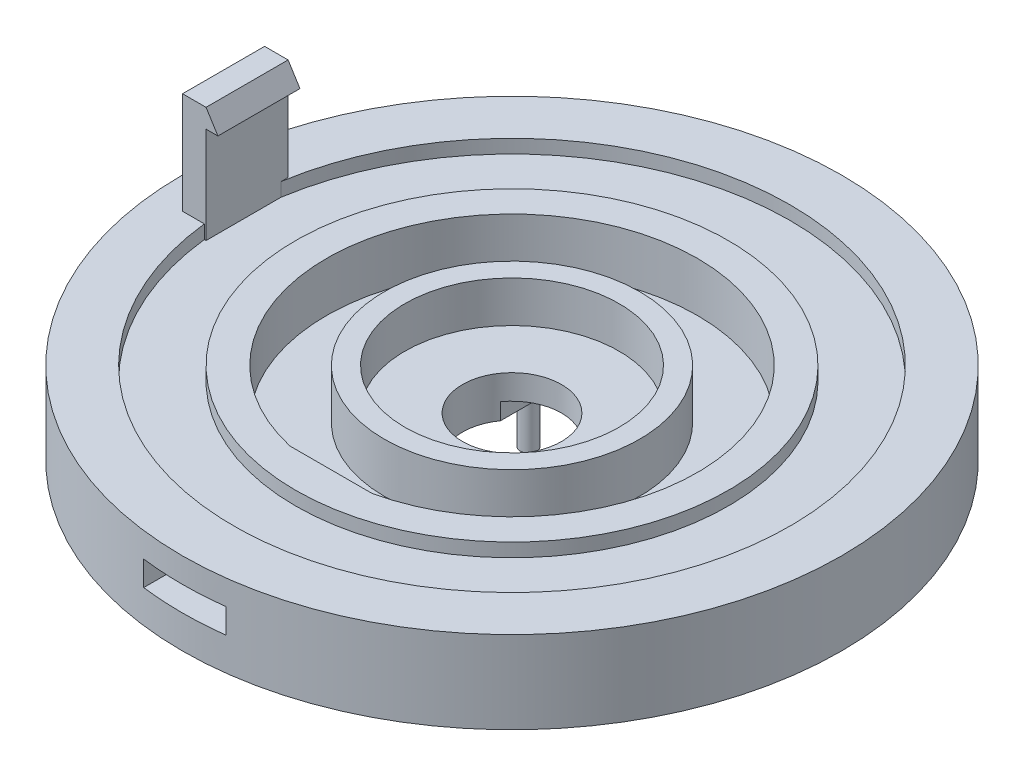
ISO-10303-21;
HEADER;
FILE_DESCRIPTION(('STEP AP214'),'2;1');
FILE_NAME('part.step','',(''),(''),'','','');
FILE_SCHEMA(('AUTOMOTIVE_DESIGN { 1 0 10303 214 1 1 1 1 }'));
ENDSEC;
DATA;
#1=APPLICATION_CONTEXT('core data for automotive mechanical design processes');
#2=APPLICATION_PROTOCOL_DEFINITION('international standard','automotive_design',2000,#1);
#3=PRODUCT_CONTEXT('',#1,'mechanical');
#4=PRODUCT('Part','Part','',(#3));
#5=PRODUCT_RELATED_PRODUCT_CATEGORY('part','',(#4));
#6=PRODUCT_DEFINITION_FORMATION('','',#4);
#7=PRODUCT_DEFINITION_CONTEXT('part definition',#1,'design');
#8=PRODUCT_DEFINITION('design','',#6,#7);
#9=PRODUCT_DEFINITION_SHAPE('','',#8);
#10=(LENGTH_UNIT() NAMED_UNIT(*) SI_UNIT(.MILLI.,.METRE.));
#11=(NAMED_UNIT(*) PLANE_ANGLE_UNIT() SI_UNIT($,.RADIAN.));
#12=(NAMED_UNIT(*) SI_UNIT($,.STERADIAN.) SOLID_ANGLE_UNIT());
#13=UNCERTAINTY_MEASURE_WITH_UNIT(LENGTH_MEASURE(1.E-05),#10,'distance_accuracy_value','');
#14=(GEOMETRIC_REPRESENTATION_CONTEXT(3) GLOBAL_UNCERTAINTY_ASSIGNED_CONTEXT((#13)) GLOBAL_UNIT_ASSIGNED_CONTEXT((#10,
#11,#12)) REPRESENTATION_CONTEXT('',''));
#15=CARTESIAN_POINT('',(0.,0.,0.));
#16=DIRECTION('',(0.,0.,1.));
#17=DIRECTION('',(1.,0.,0.));
#18=AXIS2_PLACEMENT_3D('',#15,#16,#17);
#19=CARTESIAN_POINT('',(0.,10.,0.));
#20=DIRECTION('',(0.,-1.,0.));
#21=DIRECTION('',(0.,0.,-1.));
#22=AXIS2_PLACEMENT_3D('',#19,#20,#21);
#23=PLANE('',#22);
#24=CARTESIAN_POINT('',(1.94458541445556,10.,-4.24128307319286));
#25=DIRECTION('',(0.,1.,0.));
#26=DIRECTION('',(0.,0.,1.));
#27=AXIS2_PLACEMENT_3D('',#24,#25,#26);
#28=CIRCLE('',#27,40.);
#29=CARTESIAN_POINT('',(1.94458541445556,10.,35.7587169268071));
#30=VERTEX_POINT('',#29);
#31=EDGE_CURVE('E253',#30,#30,#28,.T.);
#32=ORIENTED_EDGE('',*,*,#31,.T.);
#33=EDGE_LOOP('',(#32));
#34=FACE_BOUND('',#33,.T.);
#35=DIRECTION('',(1.,0.,0.));
#36=VECTOR('',#35,1.);
#37=CARTESIAN_POINT('',(0.,10.,-0.452703633644858));
#38=LINE('',#37,#36);
#39=CARTESIAN_POINT('',(-34.2364951699685,10.,-0.452703633644858));
#40=VERTEX_POINT('',#39);
#41=CARTESIAN_POINT('',(-31.5920984679773,10.,-0.452703633644858));
#42=VERTEX_POINT('',#41);
#43=EDGE_CURVE('E243',#40,#42,#38,.T.);
#44=ORIENTED_EDGE('',*,*,#43,.F.);
#45=DIRECTION('',(0.,0.,1.));
#46=VECTOR('',#45,1.);
#47=CARTESIAN_POINT('',(-34.2364951699685,10.,0.));
#48=LINE('',#47,#46);
#49=CARTESIAN_POINT('',(-34.2364951699685,10.,-10.4080430251595));
#50=VERTEX_POINT('',#49);
#51=EDGE_CURVE('E12',#50,#40,#48,.T.);
#52=ORIENTED_EDGE('',*,*,#51,.F.);
#53=DIRECTION('',(-1.,0.,0.));
#54=VECTOR('',#53,1.);
#55=CARTESIAN_POINT('',(0.,10.,-10.4080430251595));
#56=LINE('',#55,#54);
#57=CARTESIAN_POINT('',(-31.3854475420589,10.,-10.4080430251595));
#58=VERTEX_POINT('',#57);
#59=EDGE_CURVE('E95',#58,#50,#56,.T.);
#60=ORIENTED_EDGE('',*,*,#59,.F.);
#61=DIRECTION('',(0.,0.,-1.));
#62=VECTOR('',#61,1.);
#63=CARTESIAN_POINT('',(-31.3854475420589,10.,0.));
#64=LINE('',#63,#62);
#65=CARTESIAN_POINT('',(-31.3854475420589,10.,-9.54895705693214));
#66=VERTEX_POINT('',#65);
#67=EDGE_CURVE('E225',#66,#58,#64,.T.);
#68=ORIENTED_EDGE('',*,*,#67,.F.);
#69=CARTESIAN_POINT('',(1.94458541445557,10.,-4.24128307319287));
#70=DIRECTION('',(0.,1.,0.));
#71=DIRECTION('',(0.,0.,1.));
#72=AXIS2_PLACEMENT_3D('',#69,#70,#71);
#73=CIRCLE('',#72,33.75);
#74=EDGE_CURVE('E277',#42,#66,#73,.T.);
#75=ORIENTED_EDGE('',*,*,#74,.F.);
#76=EDGE_LOOP('',(#44,#52,#60,#68,#75));
#77=FACE_BOUND('',#76,.T.);
#78=ADVANCED_FACE('F87',(#34,#77),#23,.F.);
#79=CARTESIAN_POINT('',(1.94458541445557,8.35,-4.24128307319287));
#80=DIRECTION('',(0.,1.,0.));
#81=DIRECTION('',(0.,0.,1.));
#82=AXIS2_PLACEMENT_3D('',#79,#80,#81);
#83=CYLINDRICAL_SURFACE('',#82,33.75);
#84=DIRECTION('',(0.,1.,0.));
#85=VECTOR('',#84,1.);
#86=CARTESIAN_POINT('',(-31.5920984679773,8.35,-0.452703633644858));
#87=LINE('',#86,#85);
#88=CARTESIAN_POINT('',(-31.5920984679773,8.35,-0.452703633644858));
#89=VERTEX_POINT('',#88);
#90=EDGE_CURVE('E241',#42,#89,#87,.F.);
#91=ORIENTED_EDGE('',*,*,#90,.F.);
#92=ORIENTED_EDGE('',*,*,#74,.T.);
#93=DIRECTION('',(0.,1.,0.));
#94=VECTOR('',#93,1.);
#95=CARTESIAN_POINT('',(-31.3854475420589,8.35,-9.54895705693214));
#96=LINE('',#95,#94);
#97=CARTESIAN_POINT('',(-31.3854475420589,8.35,-9.54895705693214));
#98=VERTEX_POINT('',#97);
#99=EDGE_CURVE('E238',#98,#66,#96,.T.);
#100=ORIENTED_EDGE('',*,*,#99,.F.);
#101=CARTESIAN_POINT('',(1.94458541445557,8.35,-4.24128307319287));
#102=DIRECTION('',(0.,1.,0.));
#103=DIRECTION('',(0.,0.,1.));
#104=AXIS2_PLACEMENT_3D('',#101,#102,#103);
#105=CIRCLE('',#104,33.75);
#106=EDGE_CURVE('E280',#89,#98,#105,.T.);
#107=ORIENTED_EDGE('',*,*,#106,.F.);
#108=EDGE_LOOP('',(#91,#92,#100,#107));
#109=FACE_BOUND('',#108,.T.);
#110=ADVANCED_FACE('F391',(#109),#83,.F.);
#111=CARTESIAN_POINT('',(1.94458541445557,8.35,-4.24128307319287));
#112=DIRECTION('',(0.,1.,0.));
#113=DIRECTION('',(0.,0.,1.));
#114=AXIS2_PLACEMENT_3D('',#111,#112,#113);
#115=PLANE('',#114);
#116=CARTESIAN_POINT('',(1.94458541445557,8.35,-4.24128307319287));
#117=DIRECTION('',(0.,1.,0.));
#118=DIRECTION('',(0.,0.,1.));
#119=AXIS2_PLACEMENT_3D('',#116,#117,#118);
#120=CIRCLE('',#119,26.25);
#121=CARTESIAN_POINT('',(1.94458541445557,8.35,22.0087169268071));
#122=VERTEX_POINT('',#121);
#123=EDGE_CURVE('E274',#122,#122,#120,.T.);
#124=ORIENTED_EDGE('',*,*,#123,.F.);
#125=EDGE_LOOP('',(#124));
#126=FACE_BOUND('',#125,.T.);
#127=DIRECTION('',(0.,0.,-1.));
#128=VECTOR('',#127,1.);
#129=CARTESIAN_POINT('',(-31.3854475420589,8.35,-10.4080430251595));
#130=LINE('',#129,#128);
#131=CARTESIAN_POINT('',(-31.3854475420589,8.35,-0.452703633644858));
#132=VERTEX_POINT('',#131);
#133=EDGE_CURVE('E396',#132,#98,#130,.T.);
#134=ORIENTED_EDGE('',*,*,#133,.F.);
#135=DIRECTION('',(-1.,0.,0.));
#136=VECTOR('',#135,1.);
#137=CARTESIAN_POINT('',(1.94458541445557,8.35,-0.452703633644858));
#138=LINE('',#137,#136);
#139=EDGE_CURVE('E373',#132,#89,#138,.T.);
#140=ORIENTED_EDGE('',*,*,#139,.T.);
#141=ORIENTED_EDGE('',*,*,#106,.T.);
#142=EDGE_LOOP('',(#134,#140,#141));
#143=FACE_BOUND('',#142,.T.);
#144=ADVANCED_FACE('F395',(#126,#143),#115,.T.);
#145=CARTESIAN_POINT('',(0.,0.,0.));
#146=DIRECTION('',(0.,-1.,0.));
#147=DIRECTION('',(0.,0.,-1.));
#148=AXIS2_PLACEMENT_3D('',#145,#146,#147);
#149=PLANE('',#148);
#150=DIRECTION('',(0.,0.,-1.));
#151=VECTOR('',#150,1.);
#152=CARTESIAN_POINT('',(-2.93335983094335,0.,-18.6283350162171));
#153=LINE('',#152,#151);
#154=CARTESIAN_POINT('',(-2.93335983094335,0.,-7.73494164020971));
#155=VERTEX_POINT('',#154);
#156=CARTESIAN_POINT('',(-2.93335983094335,0.,-18.6283350162171));
#157=VERTEX_POINT('',#156);
#158=EDGE_CURVE('E259',#155,#157,#153,.T.);
#159=ORIENTED_EDGE('',*,*,#158,.F.);
#160=CARTESIAN_POINT('',(1.94458541445556,0.,-4.24128307319286));
#161=DIRECTION('',(0.,1.,0.));
#162=DIRECTION('',(0.,0.,1.));
#163=AXIS2_PLACEMENT_3D('',#160,#161,#162);
#164=CIRCLE('',#163,6.);
#165=CARTESIAN_POINT('',(6.86664016905719,0.,-7.67251856390221));
#166=VERTEX_POINT('',#165);
#167=EDGE_CURVE('E356',#155,#166,#164,.T.);
#168=ORIENTED_EDGE('',*,*,#167,.T.);
#169=DIRECTION('',(0.,0.,1.));
#170=VECTOR('',#169,1.);
#171=CARTESIAN_POINT('',(6.86664016905719,0.,-7.59099295485299));
#172=LINE('',#171,#170);
#173=CARTESIAN_POINT('',(6.86664016905719,0.,-18.6283350162171));
#174=VERTEX_POINT('',#173);
#175=EDGE_CURVE('E266',#174,#166,#172,.T.);
#176=ORIENTED_EDGE('',*,*,#175,.F.);
#177=DIRECTION('',(1.,0.,0.));
#178=VECTOR('',#177,1.);
#179=CARTESIAN_POINT('',(6.86664016905719,0.,-18.6283350162171));
#180=LINE('',#179,#178);
#181=EDGE_CURVE('E256',#157,#174,#180,.T.);
#182=ORIENTED_EDGE('',*,*,#181,.F.);
#183=EDGE_LOOP('',(#159,#168,#176,#182));
#184=FACE_BOUND('',#183,.T.);
#185=CARTESIAN_POINT('',(-8.55541458554444,0.,-4.24128307319286));
#186=DIRECTION('',(0.,-1.,0.));
#187=DIRECTION('',(0.,0.,1.));
#188=AXIS2_PLACEMENT_3D('',#185,#186,#187);
#189=CIRCLE('',#188,1.);
#190=CARTESIAN_POINT('',(-8.55541458554444,0.,-3.24128307319286));
#191=VERTEX_POINT('',#190);
#192=EDGE_CURVE('E321',#191,#191,#189,.T.);
#193=ORIENTED_EDGE('',*,*,#192,.F.);
#194=EDGE_LOOP('',(#193));
#195=FACE_BOUND('',#194,.T.);
#196=CARTESIAN_POINT('',(-8.55541458554444,0.,-16.7412830731929));
#197=DIRECTION('',(0.,-1.,0.));
#198=DIRECTION('',(0.,0.,1.));
#199=AXIS2_PLACEMENT_3D('',#196,#197,#198);
#200=CIRCLE('',#199,1.);
#201=CARTESIAN_POINT('',(-8.55541458554444,0.,-15.7412830731929));
#202=VERTEX_POINT('',#201);
#203=EDGE_CURVE('E327',#202,#202,#200,.T.);
#204=ORIENTED_EDGE('',*,*,#203,.F.);
#205=EDGE_LOOP('',(#204));
#206=FACE_BOUND('',#205,.T.);
#207=CARTESIAN_POINT('',(12.4445854144556,0.,-4.24128307319286));
#208=DIRECTION('',(0.,-1.,0.));
#209=DIRECTION('',(0.,0.,-1.));
#210=AXIS2_PLACEMENT_3D('',#207,#208,#209);
#211=CIRCLE('',#210,1.);
#212=CARTESIAN_POINT('',(12.4445854144556,0.,-5.24128307319286));
#213=VERTEX_POINT('',#212);
#214=EDGE_CURVE('E333',#213,#213,#211,.T.);
#215=ORIENTED_EDGE('',*,*,#214,.F.);
#216=EDGE_LOOP('',(#215));
#217=FACE_BOUND('',#216,.T.);
#218=CARTESIAN_POINT('',(12.4445854144556,0.,-16.7412830731929));
#219=DIRECTION('',(0.,-1.,0.));
#220=DIRECTION('',(0.,0.,-1.));
#221=AXIS2_PLACEMENT_3D('',#218,#219,#220);
#222=CIRCLE('',#221,1.);
#223=CARTESIAN_POINT('',(12.4445854144556,0.,-17.7412830731929));
#224=VERTEX_POINT('',#223);
#225=EDGE_CURVE('E339',#224,#224,#222,.T.);
#226=ORIENTED_EDGE('',*,*,#225,.F.);
#227=EDGE_LOOP('',(#226));
#228=FACE_BOUND('',#227,.T.);
#229=CARTESIAN_POINT('',(1.94458541445556,0.,-4.24128307319286));
#230=DIRECTION('',(0.,-1.,0.));
#231=DIRECTION('',(0.,0.,-1.));
#232=AXIS2_PLACEMENT_3D('',#229,#230,#231);
#233=CIRCLE('',#232,40.);
#234=CARTESIAN_POINT('',(1.94458541445556,0.,-44.2412830731929));
#235=VERTEX_POINT('',#234);
#236=EDGE_CURVE('E368',#235,#235,#233,.T.);
#237=ORIENTED_EDGE('',*,*,#236,.T.);
#238=EDGE_LOOP('',(#237));
#239=FACE_BOUND('',#238,.T.);
#240=ADVANCED_FACE('F89',(#184,#195,#206,#217,#228,#239),#149,.T.);
#241=CARTESIAN_POINT('',(1.94458541445556,4.,-4.24128307319286));
#242=DIRECTION('',(0.,1.,0.));
#243=DIRECTION('',(0.,0.,1.));
#244=AXIS2_PLACEMENT_3D('',#241,#242,#243);
#245=PLANE('',#244);
#246=CARTESIAN_POINT('',(1.94458541445556,4.,-4.24128307319286));
#247=DIRECTION('',(0.,1.,0.));
#248=DIRECTION('',(0.,0.,1.));
#249=AXIS2_PLACEMENT_3D('',#246,#247,#248);
#250=CIRCLE('',#249,15.5);
#251=CARTESIAN_POINT('',(1.94458541445556,4.,11.2587169268071));
#252=VERTEX_POINT('',#251);
#253=EDGE_CURVE('E312',#252,#252,#250,.T.);
#254=ORIENTED_EDGE('',*,*,#253,.F.);
#255=EDGE_LOOP('',(#254));
#256=FACE_BOUND('',#255,.T.);
#257=CARTESIAN_POINT('',(1.94458541445556,4.,-4.24128307319286));
#258=DIRECTION('',(0.,1.,0.));
#259=DIRECTION('',(0.,0.,1.));
#260=AXIS2_PLACEMENT_3D('',#257,#258,#259);
#261=CIRCLE('',#260,40.);
#262=CARTESIAN_POINT('',(-3.05541458554445,4.,35.444986592776));
#263=VERTEX_POINT('',#262);
#264=CARTESIAN_POINT('',(6.94458541445556,4.,35.444986592776));
#265=VERTEX_POINT('',#264);
#266=EDGE_CURVE('E251',#263,#265,#261,.T.);
#267=ORIENTED_EDGE('',*,*,#266,.T.);
#268=DIRECTION('',(0.,0.,1.));
#269=VECTOR('',#268,1.);
#270=CARTESIAN_POINT('',(6.94458541445559,4.,0.));
#271=LINE('',#270,#269);
#272=CARTESIAN_POINT('',(6.94458541445557,4.,17.6961278952874));
#273=VERTEX_POINT('',#272);
#274=EDGE_CURVE('E300',#273,#265,#271,.T.);
#275=ORIENTED_EDGE('',*,*,#274,.F.);
#276=CARTESIAN_POINT('',(1.94458541445556,4.,-4.24128307319286));
#277=DIRECTION('',(0.,1.,0.));
#278=DIRECTION('',(0.,0.,1.));
#279=AXIS2_PLACEMENT_3D('',#276,#277,#278);
#280=CIRCLE('',#279,22.5);
#281=CARTESIAN_POINT('',(-3.05541458554445,4.,17.6961278952874));
#282=VERTEX_POINT('',#281);
#283=EDGE_CURVE('E318',#273,#282,#280,.T.);
#284=ORIENTED_EDGE('',*,*,#283,.T.);
#285=DIRECTION('',(0.,0.,-1.));
#286=VECTOR('',#285,1.);
#287=CARTESIAN_POINT('',(-3.05541458554445,4.,0.));
#288=LINE('',#287,#286);
#289=EDGE_CURVE('E303',#263,#282,#288,.T.);
#290=ORIENTED_EDGE('',*,*,#289,.F.);
#291=EDGE_LOOP('',(#267,#275,#284,#290));
#292=FACE_BOUND('',#291,.T.);
#293=ADVANCED_FACE('F472',(#256,#292),#245,.T.);
#294=CARTESIAN_POINT('',(9.94458541445556,7.,35.7587169268071));
#295=DIRECTION('',(0.,1.,0.));
#296=DIRECTION('',(0.,0.,1.));
#297=AXIS2_PLACEMENT_3D('',#294,#295,#296);
#298=PLANE('',#297);
#299=DIRECTION('',(0.,0.,-1.));
#300=VECTOR('',#299,1.);
#301=CARTESIAN_POINT('',(6.94458541445559,7.,0.));
#302=LINE('',#301,#300);
#303=CARTESIAN_POINT('',(6.94458541445556,7.,35.444986592776));
#304=VERTEX_POINT('',#303);
#305=CARTESIAN_POINT('',(6.94458541445557,7.,17.6961278952874));
#306=VERTEX_POINT('',#305);
#307=EDGE_CURVE('E298',#304,#306,#302,.T.);
#308=ORIENTED_EDGE('',*,*,#307,.F.);
#309=CARTESIAN_POINT('',(1.94458541445556,7.,-4.24128307319286));
#310=DIRECTION('',(0.,1.,0.));
#311=DIRECTION('',(0.,0.,1.));
#312=AXIS2_PLACEMENT_3D('',#309,#310,#311);
#313=CIRCLE('',#312,40.);
#314=CARTESIAN_POINT('',(-3.05541458554444,7.,35.444986592776));
#315=VERTEX_POINT('',#314);
#316=EDGE_CURVE('E371',#315,#304,#313,.T.);
#317=ORIENTED_EDGE('',*,*,#316,.F.);
#318=DIRECTION('',(0.,0.,-1.));
#319=VECTOR('',#318,1.);
#320=CARTESIAN_POINT('',(-3.05541458554445,7.,35.7587169268071));
#321=LINE('',#320,#319);
#322=CARTESIAN_POINT('',(-3.05541458554445,7.,17.6961278952874));
#323=VERTEX_POINT('',#322);
#324=EDGE_CURVE('E283',#315,#323,#321,.T.);
#325=ORIENTED_EDGE('',*,*,#324,.T.);
#326=DIRECTION('',(-1.,0.,0.));
#327=VECTOR('',#326,1.);
#328=CARTESIAN_POINT('',(9.94458541445556,7.,17.6961278952874));
#329=LINE('',#328,#327);
#330=EDGE_CURVE('E292',#306,#323,#329,.T.);
#331=ORIENTED_EDGE('',*,*,#330,.F.);
#332=EDGE_LOOP('',(#308,#317,#325,#331));
#333=FACE_BOUND('',#332,.T.);
#334=ADVANCED_FACE('F474',(#333),#298,.F.);
#335=CARTESIAN_POINT('',(6.94458541445559,4.,0.));
#336=DIRECTION('',(-1.,0.,0.));
#337=DIRECTION('',(0.,0.,1.));
#338=AXIS2_PLACEMENT_3D('',#335,#336,#337);
#339=PLANE('',#338);
#340=ORIENTED_EDGE('',*,*,#274,.T.);
#341=DIRECTION('',(0.,1.,0.));
#342=VECTOR('',#341,1.);
#343=CARTESIAN_POINT('',(6.94458541445556,-10.,35.444986592776));
#344=LINE('',#343,#342);
#345=EDGE_CURVE('E245',#265,#304,#344,.T.);
#346=ORIENTED_EDGE('',*,*,#345,.T.);
#347=ORIENTED_EDGE('',*,*,#307,.T.);
#348=DIRECTION('',(0.,1.,0.));
#349=VECTOR('',#348,1.);
#350=CARTESIAN_POINT('',(6.94458541445557,4.,17.6961278952874));
#351=LINE('',#350,#349);
#352=EDGE_CURVE('E305',#273,#306,#351,.T.);
#353=ORIENTED_EDGE('',*,*,#352,.F.);
#354=EDGE_LOOP('',(#340,#346,#347,#353));
#355=FACE_BOUND('',#354,.T.);
#356=ADVANCED_FACE('F470',(#355),#339,.T.);
#357=CARTESIAN_POINT('',(-3.05541458554445,4.,0.));
#358=DIRECTION('',(1.,0.,0.));
#359=DIRECTION('',(0.,0.,-1.));
#360=AXIS2_PLACEMENT_3D('',#357,#358,#359);
#361=PLANE('',#360);
#362=ORIENTED_EDGE('',*,*,#324,.F.);
#363=DIRECTION('',(0.,1.,0.));
#364=VECTOR('',#363,1.);
#365=CARTESIAN_POINT('',(-3.05541458554445,-10.,35.444986592776));
#366=LINE('',#365,#364);
#367=EDGE_CURVE('E248',#315,#263,#366,.F.);
#368=ORIENTED_EDGE('',*,*,#367,.T.);
#369=ORIENTED_EDGE('',*,*,#289,.T.);
#370=DIRECTION('',(0.,1.,0.));
#371=VECTOR('',#370,1.);
#372=CARTESIAN_POINT('',(-3.05541458554445,4.,17.6961278952874));
#373=LINE('',#372,#371);
#374=EDGE_CURVE('E306',#282,#323,#373,.T.);
#375=ORIENTED_EDGE('',*,*,#374,.T.);
#376=EDGE_LOOP('',(#362,#368,#369,#375));
#377=FACE_BOUND('',#376,.T.);
#378=ADVANCED_FACE('F435',(#377),#361,.T.);
#379=CARTESIAN_POINT('',(1.94458541445556,10.,-4.24128307319286));
#380=DIRECTION('',(0.,1.,0.));
#381=DIRECTION('',(0.,0.,1.));
#382=AXIS2_PLACEMENT_3D('',#379,#380,#381);
#383=CIRCLE('',#382,22.5);
#384=CARTESIAN_POINT('',(6.94458541445556,10.,17.6961278952874));
#385=VERTEX_POINT('',#384);
#386=CARTESIAN_POINT('',(-3.05541458554445,10.,17.6961278952874));
#387=VERTEX_POINT('',#386);
#388=EDGE_CURVE('E315',#385,#387,#383,.T.);
#389=ORIENTED_EDGE('',*,*,#388,.F.);
#390=DIRECTION('',(-1.,0.,0.));
#391=VECTOR('',#390,1.);
#392=CARTESIAN_POINT('',(9.94458541445556,10.,17.6961278952874));
#393=LINE('',#392,#391);
#394=EDGE_CURVE('E289',#385,#387,#393,.T.);
#395=ORIENTED_EDGE('',*,*,#394,.T.);
#396=EDGE_LOOP('',(#389,#395));
#397=FACE_BOUND('',#396,.T.);
#398=CARTESIAN_POINT('',(1.94458541445557,10.,-4.24128307319287));
#399=DIRECTION('',(0.,1.,0.));
#400=DIRECTION('',(0.,0.,1.));
#401=AXIS2_PLACEMENT_3D('',#398,#399,#400);
#402=CIRCLE('',#401,26.25);
#403=CARTESIAN_POINT('',(1.94458541445557,10.,22.0087169268071));
#404=VERTEX_POINT('',#403);
#405=EDGE_CURVE('E272',#404,#404,#402,.T.);
#406=ORIENTED_EDGE('',*,*,#405,.T.);
#407=EDGE_LOOP('',(#406));
#408=FACE_BOUND('',#407,.T.);
#409=ADVANCED_FACE('F426',(#397,#408),#23,.F.);
#410=CARTESIAN_POINT('',(1.94458541445556,4.,-4.24128307319286));
#411=DIRECTION('',(0.,1.,0.));
#412=DIRECTION('',(0.,0.,1.));
#413=AXIS2_PLACEMENT_3D('',#410,#411,#412);
#414=CYLINDRICAL_SURFACE('',#413,22.5);
#415=ORIENTED_EDGE('',*,*,#352,.T.);
#416=DIRECTION('',(0.,1.,0.));
#417=VECTOR('',#416,1.);
#418=CARTESIAN_POINT('',(6.94458541445557,4.,17.6961278952874));
#419=LINE('',#418,#417);
#420=EDGE_CURVE('E295',#306,#385,#419,.T.);
#421=ORIENTED_EDGE('',*,*,#420,.T.);
#422=ORIENTED_EDGE('',*,*,#388,.T.);
#423=DIRECTION('',(0.,1.,0.));
#424=VECTOR('',#423,1.);
#425=CARTESIAN_POINT('',(-3.05541458554445,7.,17.6961278952874));
#426=LINE('',#425,#424);
#427=EDGE_CURVE('E287',#323,#387,#426,.T.);
#428=ORIENTED_EDGE('',*,*,#427,.F.);
#429=ORIENTED_EDGE('',*,*,#374,.F.);
#430=ORIENTED_EDGE('',*,*,#283,.F.);
#431=EDGE_LOOP('',(#415,#421,#422,#428,#429,#430));
#432=FACE_BOUND('',#431,.T.);
#433=ADVANCED_FACE('F434',(#432),#414,.F.);
#434=CARTESIAN_POINT('',(1.94458541445556,10.,-4.24128307319286));
#435=DIRECTION('',(0.,1.,0.));
#436=DIRECTION('',(0.,0.,1.));
#437=AXIS2_PLACEMENT_3D('',#434,#435,#436);
#438=CIRCLE('',#437,13.);
#439=CARTESIAN_POINT('',(1.94458541445556,10.,8.75871692680714));
#440=VERTEX_POINT('',#439);
#441=EDGE_CURVE('E345',#440,#440,#438,.T.);
#442=ORIENTED_EDGE('',*,*,#441,.F.);
#443=EDGE_LOOP('',(#442));
#444=FACE_BOUND('',#443,.T.);
#445=CARTESIAN_POINT('',(1.94458541445556,10.,-4.24128307319286));
#446=DIRECTION('',(0.,1.,0.));
#447=DIRECTION('',(0.,0.,1.));
#448=AXIS2_PLACEMENT_3D('',#445,#446,#447);
#449=CIRCLE('',#448,15.5);
#450=CARTESIAN_POINT('',(1.94458541445556,10.,11.2587169268071));
#451=VERTEX_POINT('',#450);
#452=EDGE_CURVE('E309',#451,#451,#449,.T.);
#453=ORIENTED_EDGE('',*,*,#452,.T.);
#454=EDGE_LOOP('',(#453));
#455=FACE_BOUND('',#454,.T.);
#456=ADVANCED_FACE('F427',(#444,#455),#23,.F.);
#457=CARTESIAN_POINT('',(1.94458541445556,10.,-4.24128307319286));
#458=DIRECTION('',(0.,1.,0.));
#459=DIRECTION('',(0.,0.,1.));
#460=AXIS2_PLACEMENT_3D('',#457,#458,#459);
#461=CYLINDRICAL_SURFACE('',#460,6.);
#462=ORIENTED_EDGE('',*,*,#167,.F.);
#463=DIRECTION('',(0.,1.,0.));
#464=VECTOR('',#463,1.);
#465=CARTESIAN_POINT('',(-2.93335983094335,10.,-7.73494164020971));
#466=LINE('',#465,#464);
#467=CARTESIAN_POINT('',(-2.93335983094335,2.,-7.73494164020971));
#468=VERTEX_POINT('',#467);
#469=EDGE_CURVE('E365',#155,#468,#466,.T.);
#470=ORIENTED_EDGE('',*,*,#469,.T.);
#471=CARTESIAN_POINT('',(1.94458541445556,2.,-4.24128307319286));
#472=DIRECTION('',(0.,1.,0.));
#473=DIRECTION('',(0.,0.,1.));
#474=AXIS2_PLACEMENT_3D('',#471,#472,#473);
#475=CIRCLE('',#474,6.);
#476=CARTESIAN_POINT('',(6.86664016905719,2.,-7.67251856390221));
#477=VERTEX_POINT('',#476);
#478=EDGE_CURVE('E359',#468,#477,#475,.F.);
#479=ORIENTED_EDGE('',*,*,#478,.T.);
#480=DIRECTION('',(0.,1.,0.));
#481=VECTOR('',#480,1.);
#482=CARTESIAN_POINT('',(6.86664016905719,10.,-7.67251856390221));
#483=LINE('',#482,#481);
#484=EDGE_CURVE('E362',#477,#166,#483,.F.);
#485=ORIENTED_EDGE('',*,*,#484,.T.);
#486=EDGE_LOOP('',(#462,#470,#479,#485));
#487=FACE_BOUND('',#486,.T.);
#488=CARTESIAN_POINT('',(1.94458541445556,5.,-4.24128307319286));
#489=DIRECTION('',(0.,1.,0.));
#490=DIRECTION('',(0.,0.,1.));
#491=AXIS2_PLACEMENT_3D('',#488,#489,#490);
#492=CIRCLE('',#491,6.);
#493=CARTESIAN_POINT('',(1.94458541445556,5.,1.75871692680714));
#494=VERTEX_POINT('',#493);
#495=EDGE_CURVE('E353',#494,#494,#492,.T.);
#496=ORIENTED_EDGE('',*,*,#495,.T.);
#497=EDGE_LOOP('',(#496));
#498=FACE_BOUND('',#497,.T.);
#499=ADVANCED_FACE('F438',(#487,#498),#461,.F.);
#500=CARTESIAN_POINT('',(7.94458541445556,5.,-4.24128307319286));
#501=DIRECTION('',(0.,-1.,0.));
#502=DIRECTION('',(0.,0.,-1.));
#503=AXIS2_PLACEMENT_3D('',#500,#501,#502);
#504=PLANE('',#503);
#505=ORIENTED_EDGE('',*,*,#495,.F.);
#506=EDGE_LOOP('',(#505));
#507=FACE_BOUND('',#506,.T.);
#508=CARTESIAN_POINT('',(1.94458541445556,5.,-4.24128307319286));
#509=DIRECTION('',(0.,1.,0.));
#510=DIRECTION('',(0.,0.,1.));
#511=AXIS2_PLACEMENT_3D('',#508,#509,#510);
#512=CIRCLE('',#511,13.);
#513=CARTESIAN_POINT('',(1.94458541445556,5.,8.75871692680714));
#514=VERTEX_POINT('',#513);
#515=EDGE_CURVE('E350',#514,#514,#512,.T.);
#516=ORIENTED_EDGE('',*,*,#515,.T.);
#517=EDGE_LOOP('',(#516));
#518=FACE_BOUND('',#517,.T.);
#519=ADVANCED_FACE('F444',(#507,#518),#504,.F.);
#520=CARTESIAN_POINT('',(1.94458541445556,10.,-4.24128307319286));
#521=DIRECTION('',(0.,1.,0.));
#522=DIRECTION('',(0.,0.,1.));
#523=AXIS2_PLACEMENT_3D('',#520,#521,#522);
#524=CYLINDRICAL_SURFACE('',#523,13.);
#525=ORIENTED_EDGE('',*,*,#515,.F.);
#526=EDGE_LOOP('',(#525));
#527=FACE_BOUND('',#526,.T.);
#528=ORIENTED_EDGE('',*,*,#441,.T.);
#529=EDGE_LOOP('',(#528));
#530=FACE_BOUND('',#529,.T.);
#531=ADVANCED_FACE('F503',(#527,#530),#524,.F.);
#532=CARTESIAN_POINT('',(12.4445854144556,-10.,-16.7412830731929));
#533=DIRECTION('',(0.,1.,0.));
#534=DIRECTION('',(0.,0.,1.));
#535=AXIS2_PLACEMENT_3D('',#532,#533,#534);
#536=CYLINDRICAL_SURFACE('',#535,1.);
#537=CARTESIAN_POINT('',(12.4445854144556,-10.,-16.7412830731929));
#538=DIRECTION('',(0.,-1.,0.));
#539=DIRECTION('',(0.,0.,-1.));
#540=AXIS2_PLACEMENT_3D('',#537,#538,#539);
#541=CIRCLE('',#540,1.);
#542=CARTESIAN_POINT('',(12.4445854144556,-10.,-17.7412830731929));
#543=VERTEX_POINT('',#542);
#544=EDGE_CURVE('E342',#543,#543,#541,.T.);
#545=ORIENTED_EDGE('',*,*,#544,.F.);
#546=EDGE_LOOP('',(#545));
#547=FACE_BOUND('',#546,.T.);
#548=ORIENTED_EDGE('',*,*,#225,.T.);
#549=EDGE_LOOP('',(#548));
#550=FACE_BOUND('',#549,.T.);
#551=ADVANCED_FACE('F499',(#547,#550),#536,.T.);
#552=CARTESIAN_POINT('',(12.4445854144556,-10.,-16.7412830731929));
#553=DIRECTION('',(0.,-1.,0.));
#554=DIRECTION('',(0.,0.,-1.));
#555=AXIS2_PLACEMENT_3D('',#552,#553,#554);
#556=PLANE('',#555);
#557=ORIENTED_EDGE('',*,*,#544,.T.);
#558=EDGE_LOOP('',(#557));
#559=FACE_BOUND('',#558,.T.);
#560=ADVANCED_FACE('F495',(#559),#556,.T.);
#561=CARTESIAN_POINT('',(12.4445854144556,-10.,-4.24128307319286));
#562=DIRECTION('',(0.,1.,0.));
#563=DIRECTION('',(0.,0.,1.));
#564=AXIS2_PLACEMENT_3D('',#561,#562,#563);
#565=CYLINDRICAL_SURFACE('',#564,1.);
#566=CARTESIAN_POINT('',(12.4445854144556,-10.,-4.24128307319286));
#567=DIRECTION('',(0.,-1.,0.));
#568=DIRECTION('',(0.,0.,-1.));
#569=AXIS2_PLACEMENT_3D('',#566,#567,#568);
#570=CIRCLE('',#569,1.);
#571=CARTESIAN_POINT('',(12.4445854144556,-10.,-5.24128307319286));
#572=VERTEX_POINT('',#571);
#573=EDGE_CURVE('E336',#572,#572,#570,.T.);
#574=ORIENTED_EDGE('',*,*,#573,.F.);
#575=EDGE_LOOP('',(#574));
#576=FACE_BOUND('',#575,.T.);
#577=ORIENTED_EDGE('',*,*,#214,.T.);
#578=EDGE_LOOP('',(#577));
#579=FACE_BOUND('',#578,.T.);
#580=ADVANCED_FACE('F491',(#576,#579),#565,.T.);
#581=CARTESIAN_POINT('',(12.4445854144556,-10.,-4.24128307319286));
#582=DIRECTION('',(0.,-1.,0.));
#583=DIRECTION('',(0.,0.,-1.));
#584=AXIS2_PLACEMENT_3D('',#581,#582,#583);
#585=PLANE('',#584);
#586=ORIENTED_EDGE('',*,*,#573,.T.);
#587=EDGE_LOOP('',(#586));
#588=FACE_BOUND('',#587,.T.);
#589=ADVANCED_FACE('F487',(#588),#585,.T.);
#590=CARTESIAN_POINT('',(-8.55541458554444,-10.,-16.7412830731929));
#591=DIRECTION('',(0.,1.,0.));
#592=DIRECTION('',(0.,0.,1.));
#593=AXIS2_PLACEMENT_3D('',#590,#591,#592);
#594=CYLINDRICAL_SURFACE('',#593,1.);
#595=CARTESIAN_POINT('',(-8.55541458554444,-10.,-16.7412830731929));
#596=DIRECTION('',(0.,-1.,0.));
#597=DIRECTION('',(0.,0.,1.));
#598=AXIS2_PLACEMENT_3D('',#595,#596,#597);
#599=CIRCLE('',#598,1.);
#600=CARTESIAN_POINT('',(-8.55541458554444,-10.,-15.7412830731929));
#601=VERTEX_POINT('',#600);
#602=EDGE_CURVE('E330',#601,#601,#599,.T.);
#603=ORIENTED_EDGE('',*,*,#602,.F.);
#604=EDGE_LOOP('',(#603));
#605=FACE_BOUND('',#604,.T.);
#606=ORIENTED_EDGE('',*,*,#203,.T.);
#607=EDGE_LOOP('',(#606));
#608=FACE_BOUND('',#607,.T.);
#609=ADVANCED_FACE('F483',(#605,#608),#594,.T.);
#610=CARTESIAN_POINT('',(-8.55541458554444,-10.,-16.7412830731929));
#611=DIRECTION('',(0.,1.,0.));
#612=DIRECTION('',(0.,0.,1.));
#613=AXIS2_PLACEMENT_3D('',#610,#611,#612);
#614=PLANE('',#613);
#615=ORIENTED_EDGE('',*,*,#602,.T.);
#616=EDGE_LOOP('',(#615));
#617=FACE_BOUND('',#616,.T.);
#618=ADVANCED_FACE('F479',(#617),#614,.F.);
#619=CARTESIAN_POINT('',(-8.55541458554444,-10.,-4.24128307319286));
#620=DIRECTION('',(0.,1.,0.));
#621=DIRECTION('',(0.,0.,1.));
#622=AXIS2_PLACEMENT_3D('',#619,#620,#621);
#623=CYLINDRICAL_SURFACE('',#622,1.);
#624=CARTESIAN_POINT('',(-8.55541458554444,-10.,-4.24128307319286));
#625=DIRECTION('',(0.,-1.,0.));
#626=DIRECTION('',(0.,0.,1.));
#627=AXIS2_PLACEMENT_3D('',#624,#625,#626);
#628=CIRCLE('',#627,1.);
#629=CARTESIAN_POINT('',(-8.55541458554444,-10.,-3.24128307319286));
#630=VERTEX_POINT('',#629);
#631=EDGE_CURVE('E324',#630,#630,#628,.T.);
#632=ORIENTED_EDGE('',*,*,#631,.F.);
#633=EDGE_LOOP('',(#632));
#634=FACE_BOUND('',#633,.T.);
#635=ORIENTED_EDGE('',*,*,#192,.T.);
#636=EDGE_LOOP('',(#635));
#637=FACE_BOUND('',#636,.T.);
#638=ADVANCED_FACE('F465',(#634,#637),#623,.T.);
#639=CARTESIAN_POINT('',(-8.55541458554444,-10.,-4.24128307319286));
#640=DIRECTION('',(0.,1.,0.));
#641=DIRECTION('',(0.,0.,1.));
#642=AXIS2_PLACEMENT_3D('',#639,#640,#641);
#643=PLANE('',#642);
#644=ORIENTED_EDGE('',*,*,#631,.T.);
#645=EDGE_LOOP('',(#644));
#646=FACE_BOUND('',#645,.T.);
#647=ADVANCED_FACE('F455',(#646),#643,.F.);
#648=CARTESIAN_POINT('',(1.94458541445556,4.,-4.24128307319286));
#649=DIRECTION('',(0.,1.,0.));
#650=DIRECTION('',(0.,0.,1.));
#651=AXIS2_PLACEMENT_3D('',#648,#649,#650);
#652=CYLINDRICAL_SURFACE('',#651,15.5);
#653=ORIENTED_EDGE('',*,*,#253,.T.);
#654=EDGE_LOOP('',(#653));
#655=FACE_BOUND('',#654,.T.);
#656=ORIENTED_EDGE('',*,*,#452,.F.);
#657=EDGE_LOOP('',(#656));
#658=FACE_BOUND('',#657,.T.);
#659=ADVANCED_FACE('F452',(#655,#658),#652,.T.);
#660=CARTESIAN_POINT('',(9.94458541445556,7.,17.6961278952874));
#661=DIRECTION('',(0.,0.,1.));
#662=DIRECTION('',(1.,0.,0.));
#663=AXIS2_PLACEMENT_3D('',#660,#661,#662);
#664=PLANE('',#663);
#665=ORIENTED_EDGE('',*,*,#420,.F.);
#666=ORIENTED_EDGE('',*,*,#330,.T.);
#667=ORIENTED_EDGE('',*,*,#427,.T.);
#668=ORIENTED_EDGE('',*,*,#394,.F.);
#669=EDGE_LOOP('',(#665,#666,#667,#668));
#670=FACE_BOUND('',#669,.T.);
#671=ADVANCED_FACE('F454',(#670),#664,.F.);
#672=CARTESIAN_POINT('',(1.94458541445557,8.35,-4.24128307319287));
#673=DIRECTION('',(0.,1.,0.));
#674=DIRECTION('',(0.,0.,1.));
#675=AXIS2_PLACEMENT_3D('',#672,#673,#674);
#676=CYLINDRICAL_SURFACE('',#675,26.25);
#677=ORIENTED_EDGE('',*,*,#123,.T.);
#678=EDGE_LOOP('',(#677));
#679=FACE_BOUND('',#678,.T.);
#680=ORIENTED_EDGE('',*,*,#405,.F.);
#681=EDGE_LOOP('',(#680));
#682=FACE_BOUND('',#681,.T.);
#683=ADVANCED_FACE('F462',(#679,#682),#676,.T.);
#684=CARTESIAN_POINT('',(-2.93335983094335,2.,-18.6283350162171));
#685=DIRECTION('',(-1.,0.,0.));
#686=DIRECTION('',(0.,0.,1.));
#687=AXIS2_PLACEMENT_3D('',#684,#685,#686);
#688=PLANE('',#687);
#689=ORIENTED_EDGE('',*,*,#158,.T.);
#690=DIRECTION('',(0.,-1.,0.));
#691=VECTOR('',#690,1.);
#692=CARTESIAN_POINT('',(-2.93335983094335,2.,-18.6283350162171));
#693=LINE('',#692,#691);
#694=CARTESIAN_POINT('',(-2.93335983094335,2.,-18.6283350162171));
#695=VERTEX_POINT('',#694);
#696=EDGE_CURVE('E269',#695,#157,#693,.T.);
#697=ORIENTED_EDGE('',*,*,#696,.F.);
#698=DIRECTION('',(0.,0.,-1.));
#699=VECTOR('',#698,1.);
#700=CARTESIAN_POINT('',(-2.93335983094335,2.,-18.6283350162171));
#701=LINE('',#700,#699);
#702=EDGE_CURVE('E261',#468,#695,#701,.T.);
#703=ORIENTED_EDGE('',*,*,#702,.F.);
#704=ORIENTED_EDGE('',*,*,#469,.F.);
#705=EDGE_LOOP('',(#689,#697,#703,#704));
#706=FACE_BOUND('',#705,.T.);
#707=ADVANCED_FACE('F591',(#706),#688,.F.);
#708=CARTESIAN_POINT('',(6.86664016905719,2.,-7.59099295485299));
#709=DIRECTION('',(1.,0.,0.));
#710=DIRECTION('',(0.,0.,-1.));
#711=AXIS2_PLACEMENT_3D('',#708,#709,#710);
#712=PLANE('',#711);
#713=DIRECTION('',(0.,0.,1.));
#714=VECTOR('',#713,1.);
#715=CARTESIAN_POINT('',(6.86664016905719,2.,-7.59099295485299));
#716=LINE('',#715,#714);
#717=CARTESIAN_POINT('',(6.86664016905719,2.,-18.6283350162171));
#718=VERTEX_POINT('',#717);
#719=EDGE_CURVE('E110',#718,#477,#716,.T.);
#720=ORIENTED_EDGE('',*,*,#719,.F.);
#721=DIRECTION('',(0.,-1.,0.));
#722=VECTOR('',#721,1.);
#723=CARTESIAN_POINT('',(6.86664016905719,2.,-18.6283350162171));
#724=LINE('',#723,#722);
#725=EDGE_CURVE('E263',#718,#174,#724,.T.);
#726=ORIENTED_EDGE('',*,*,#725,.T.);
#727=ORIENTED_EDGE('',*,*,#175,.T.);
#728=ORIENTED_EDGE('',*,*,#484,.F.);
#729=EDGE_LOOP('',(#720,#726,#727,#728));
#730=FACE_BOUND('',#729,.T.);
#731=ADVANCED_FACE('F606',(#730),#712,.F.);
#732=CARTESIAN_POINT('',(0.,2.,0.));
#733=DIRECTION('',(0.,1.,0.));
#734=DIRECTION('',(0.,0.,1.));
#735=AXIS2_PLACEMENT_3D('',#732,#733,#734);
#736=PLANE('',#735);
#737=ORIENTED_EDGE('',*,*,#702,.T.);
#738=DIRECTION('',(1.,0.,0.));
#739=VECTOR('',#738,1.);
#740=CARTESIAN_POINT('',(6.86664016905719,2.,-18.6283350162171));
#741=LINE('',#740,#739);
#742=EDGE_CURVE('E257',#695,#718,#741,.T.);
#743=ORIENTED_EDGE('',*,*,#742,.T.);
#744=ORIENTED_EDGE('',*,*,#719,.T.);
#745=ORIENTED_EDGE('',*,*,#478,.F.);
#746=EDGE_LOOP('',(#737,#743,#744,#745));
#747=FACE_BOUND('',#746,.T.);
#748=ADVANCED_FACE('F616',(#747),#736,.F.);
#749=CARTESIAN_POINT('',(6.86664016905719,2.,-18.6283350162171));
#750=DIRECTION('',(0.,0.,-1.));
#751=DIRECTION('',(-1.,0.,0.));
#752=AXIS2_PLACEMENT_3D('',#749,#750,#751);
#753=PLANE('',#752);
#754=ORIENTED_EDGE('',*,*,#181,.T.);
#755=ORIENTED_EDGE('',*,*,#725,.F.);
#756=ORIENTED_EDGE('',*,*,#742,.F.);
#757=ORIENTED_EDGE('',*,*,#696,.T.);
#758=EDGE_LOOP('',(#754,#755,#756,#757));
#759=FACE_BOUND('',#758,.T.);
#760=ADVANCED_FACE('F626',(#759),#753,.F.);
#761=CARTESIAN_POINT('',(1.94458541445556,-10.,-4.24128307319286));
#762=DIRECTION('',(0.,1.,0.));
#763=DIRECTION('',(0.,0.,1.));
#764=AXIS2_PLACEMENT_3D('',#761,#762,#763);
#765=CYLINDRICAL_SURFACE('',#764,40.);
#766=ORIENTED_EDGE('',*,*,#31,.F.);
#767=EDGE_LOOP('',(#766));
#768=FACE_BOUND('',#767,.T.);
#769=ORIENTED_EDGE('',*,*,#236,.F.);
#770=EDGE_LOOP('',(#769));
#771=FACE_BOUND('',#770,.T.);
#772=ORIENTED_EDGE('',*,*,#316,.T.);
#773=ORIENTED_EDGE('',*,*,#345,.F.);
#774=ORIENTED_EDGE('',*,*,#266,.F.);
#775=ORIENTED_EDGE('',*,*,#367,.F.);
#776=EDGE_LOOP('',(#772,#773,#774,#775));
#777=FACE_BOUND('',#776,.T.);
#778=ADVANCED_FACE('F635',(#768,#771,#777),#765,.T.);
#779=CARTESIAN_POINT('',(-34.2364951699685,22.35,-10.4080430251595));
#780=DIRECTION('',(1.,0.,0.));
#781=DIRECTION('',(0.,0.,-1.));
#782=AXIS2_PLACEMENT_3D('',#779,#780,#781);
#783=PLANE('',#782);
#784=DIRECTION('',(0.,-1.,0.));
#785=VECTOR('',#784,1.);
#786=CARTESIAN_POINT('',(-34.2364951699685,22.35,-10.4080430251595));
#787=LINE('',#786,#785);
#788=CARTESIAN_POINT('',(-34.2364951699685,22.35,-10.4080430251595));
#789=VERTEX_POINT('',#788);
#790=EDGE_CURVE('E227',#789,#50,#787,.T.);
#791=ORIENTED_EDGE('',*,*,#790,.T.);
#792=ORIENTED_EDGE('',*,*,#51,.T.);
#793=DIRECTION('',(0.,-1.,0.));
#794=VECTOR('',#793,1.);
#795=CARTESIAN_POINT('',(-34.2364951699685,22.35,-0.452703633644858));
#796=LINE('',#795,#794);
#797=CARTESIAN_POINT('',(-34.2364951699685,22.35,-0.452703633644858));
#798=VERTEX_POINT('',#797);
#799=EDGE_CURVE('E229',#798,#40,#796,.T.);
#800=ORIENTED_EDGE('',*,*,#799,.F.);
#801=DIRECTION('',(0.,0.,1.));
#802=VECTOR('',#801,1.);
#803=CARTESIAN_POINT('',(-34.2364951699685,22.35,-10.4080430251595));
#804=LINE('',#803,#802);
#805=EDGE_CURVE('E383',#789,#798,#804,.T.);
#806=ORIENTED_EDGE('',*,*,#805,.F.);
#807=EDGE_LOOP('',(#791,#792,#800,#806));
#808=FACE_BOUND('',#807,.T.);
#809=ADVANCED_FACE('F380',(#808),#783,.F.);
#810=CARTESIAN_POINT('',(-34.2364951699685,22.35,-10.4080430251595));
#811=DIRECTION('',(0.,0.,1.));
#812=DIRECTION('',(1.,0.,0.));
#813=AXIS2_PLACEMENT_3D('',#810,#811,#812);
#814=PLANE('',#813);
#815=DIRECTION('',(-1.,0.,0.));
#816=VECTOR('',#815,1.);
#817=CARTESIAN_POINT('',(-34.2364951699685,22.35,-10.4080430251595));
#818=LINE('',#817,#816);
#819=CARTESIAN_POINT('',(-31.3854475420589,22.35,-10.4080430251595));
#820=VERTEX_POINT('',#819);
#821=EDGE_CURVE('E232',#820,#789,#818,.T.);
#822=ORIENTED_EDGE('',*,*,#821,.F.);
#823=DIRECTION('',(-0.532113378489092,0.846673108367642,0.));
#824=VECTOR('',#823,1.);
#825=CARTESIAN_POINT('',(-29.9444715239439,20.057188554806,-10.4080430251595));
#826=LINE('',#825,#824);
#827=CARTESIAN_POINT('',(-29.9444715239439,20.057188554806,-10.4080430251595));
#828=VERTEX_POINT('',#827);
#829=EDGE_CURVE('E221',#828,#820,#826,.T.);
#830=ORIENTED_EDGE('',*,*,#829,.F.);
#831=DIRECTION('',(1.,0.,0.));
#832=VECTOR('',#831,1.);
#833=CARTESIAN_POINT('',(-31.3854475420589,20.057188554806,-10.4080430251595));
#834=LINE('',#833,#832);
#835=CARTESIAN_POINT('',(-31.3854475420589,20.057188554806,-10.4080430251595));
#836=VERTEX_POINT('',#835);
#837=EDGE_CURVE('E209',#836,#828,#834,.T.);
#838=ORIENTED_EDGE('',*,*,#837,.F.);
#839=DIRECTION('',(0.,-1.,0.));
#840=VECTOR('',#839,1.);
#841=CARTESIAN_POINT('',(-31.3854475420589,22.35,-10.4080430251595));
#842=LINE('',#841,#840);
#843=EDGE_CURVE('E219',#836,#58,#842,.T.);
#844=ORIENTED_EDGE('',*,*,#843,.T.);
#845=ORIENTED_EDGE('',*,*,#59,.T.);
#846=ORIENTED_EDGE('',*,*,#790,.F.);
#847=EDGE_LOOP('',(#822,#830,#838,#844,#845,#846));
#848=FACE_BOUND('',#847,.T.);
#849=ADVANCED_FACE('F218',(#848),#814,.F.);
#850=CARTESIAN_POINT('',(-34.2364951699685,22.35,-0.452703633644858));
#851=DIRECTION('',(0.,0.,-1.));
#852=DIRECTION('',(-1.,0.,0.));
#853=AXIS2_PLACEMENT_3D('',#850,#851,#852);
#854=PLANE('',#853);
#855=ORIENTED_EDGE('',*,*,#799,.T.);
#856=ORIENTED_EDGE('',*,*,#43,.T.);
#857=ORIENTED_EDGE('',*,*,#90,.T.);
#858=ORIENTED_EDGE('',*,*,#139,.F.);
#859=DIRECTION('',(0.,-1.,0.));
#860=VECTOR('',#859,1.);
#861=CARTESIAN_POINT('',(-31.3854475420589,22.35,-0.452703633644858));
#862=LINE('',#861,#860);
#863=CARTESIAN_POINT('',(-31.3854475420589,20.057188554806,-0.452703633644858));
#864=VERTEX_POINT('',#863);
#865=EDGE_CURVE('E102',#864,#132,#862,.T.);
#866=ORIENTED_EDGE('',*,*,#865,.F.);
#867=DIRECTION('',(1.,0.,0.));
#868=VECTOR('',#867,1.);
#869=CARTESIAN_POINT('',(-31.3854475420589,20.057188554806,-0.452703633644858));
#870=LINE('',#869,#868);
#871=CARTESIAN_POINT('',(-29.9444715239439,20.057188554806,-0.452703633644858));
#872=VERTEX_POINT('',#871);
#873=EDGE_CURVE('E211',#864,#872,#870,.T.);
#874=ORIENTED_EDGE('',*,*,#873,.T.);
#875=DIRECTION('',(-0.532113378489092,0.846673108367642,0.));
#876=VECTOR('',#875,1.);
#877=CARTESIAN_POINT('',(-29.9444715239439,20.057188554806,-0.452703633644858));
#878=LINE('',#877,#876);
#879=CARTESIAN_POINT('',(-31.3854475420589,22.35,-0.452703633644858));
#880=VERTEX_POINT('',#879);
#881=EDGE_CURVE('E399',#872,#880,#878,.T.);
#882=ORIENTED_EDGE('',*,*,#881,.T.);
#883=DIRECTION('',(1.,0.,0.));
#884=VECTOR('',#883,1.);
#885=CARTESIAN_POINT('',(-34.2364951699685,22.35,-0.452703633644858));
#886=LINE('',#885,#884);
#887=EDGE_CURVE('E407',#798,#880,#886,.T.);
#888=ORIENTED_EDGE('',*,*,#887,.F.);
#889=EDGE_LOOP('',(#855,#856,#857,#858,#866,#874,#882,#888));
#890=FACE_BOUND('',#889,.T.);
#891=ADVANCED_FACE('F388',(#890),#854,.F.);
#892=CARTESIAN_POINT('',(-31.3854475420589,22.35,-10.4080430251595));
#893=DIRECTION('',(-1.,0.,0.));
#894=DIRECTION('',(0.,0.,1.));
#895=AXIS2_PLACEMENT_3D('',#892,#893,#894);
#896=PLANE('',#895);
#897=ORIENTED_EDGE('',*,*,#843,.F.);
#898=DIRECTION('',(0.,0.,1.));
#899=VECTOR('',#898,1.);
#900=CARTESIAN_POINT('',(-31.3854475420589,20.057188554806,-10.4080430251595));
#901=LINE('',#900,#899);
#902=EDGE_CURVE('E206',#836,#864,#901,.T.);
#903=ORIENTED_EDGE('',*,*,#902,.T.);
#904=ORIENTED_EDGE('',*,*,#865,.T.);
#905=ORIENTED_EDGE('',*,*,#133,.T.);
#906=ORIENTED_EDGE('',*,*,#99,.T.);
#907=ORIENTED_EDGE('',*,*,#67,.T.);
#908=EDGE_LOOP('',(#897,#903,#904,#905,#906,#907));
#909=FACE_BOUND('',#908,.T.);
#910=ADVANCED_FACE('F223',(#909),#896,.F.);
#911=CARTESIAN_POINT('',(0.,22.35,0.));
#912=DIRECTION('',(0.,1.,0.));
#913=DIRECTION('',(0.,0.,1.));
#914=AXIS2_PLACEMENT_3D('',#911,#912,#913);
#915=PLANE('',#914);
#916=ORIENTED_EDGE('',*,*,#805,.T.);
#917=ORIENTED_EDGE('',*,*,#887,.T.);
#918=DIRECTION('',(0.,0.,-1.));
#919=VECTOR('',#918,1.);
#920=CARTESIAN_POINT('',(-31.3854475420589,22.35,-10.4080430251595));
#921=LINE('',#920,#919);
#922=EDGE_CURVE('E409',#880,#820,#921,.T.);
#923=ORIENTED_EDGE('',*,*,#922,.T.);
#924=ORIENTED_EDGE('',*,*,#821,.T.);
#925=EDGE_LOOP('',(#916,#917,#923,#924));
#926=FACE_BOUND('',#925,.T.);
#927=ADVANCED_FACE('F413',(#926),#915,.T.);
#928=CARTESIAN_POINT('',(-29.9444715239439,20.057188554806,-10.4080430251595));
#929=DIRECTION('',(0.846673108367642,0.532113378489092,0.));
#930=DIRECTION('',(-0.532113378489092,0.846673108367642,0.));
#931=AXIS2_PLACEMENT_3D('',#928,#929,#930);
#932=PLANE('',#931);
#933=ORIENTED_EDGE('',*,*,#881,.F.);
#934=DIRECTION('',(0.,0.,1.));
#935=VECTOR('',#934,1.);
#936=CARTESIAN_POINT('',(-29.9444715239439,20.057188554806,-10.4080430251595));
#937=LINE('',#936,#935);
#938=EDGE_CURVE('E213',#828,#872,#937,.T.);
#939=ORIENTED_EDGE('',*,*,#938,.F.);
#940=ORIENTED_EDGE('',*,*,#829,.T.);
#941=ORIENTED_EDGE('',*,*,#922,.F.);
#942=EDGE_LOOP('',(#933,#939,#940,#941));
#943=FACE_BOUND('',#942,.T.);
#944=ADVANCED_FACE('F415',(#943),#932,.T.);
#945=CARTESIAN_POINT('',(-31.3854475420589,20.057188554806,-10.4080430251595));
#946=DIRECTION('',(0.,-1.,0.));
#947=DIRECTION('',(0.,0.,-1.));
#948=AXIS2_PLACEMENT_3D('',#945,#946,#947);
#949=PLANE('',#948);
#950=ORIENTED_EDGE('',*,*,#873,.F.);
#951=ORIENTED_EDGE('',*,*,#902,.F.);
#952=ORIENTED_EDGE('',*,*,#837,.T.);
#953=ORIENTED_EDGE('',*,*,#938,.T.);
#954=EDGE_LOOP('',(#950,#951,#952,#953));
#955=FACE_BOUND('',#954,.T.);
#956=ADVANCED_FACE('F208',(#955),#949,.T.);
#957=CLOSED_SHELL('',(#78,#110,#144,#240,#293,#334,#356,#378,#409,#433,#456,#499,#519,#531,#551,
#560,#580,#589,#609,#618,#638,#647,#659,#671,#683,#707,#731,#748,#760,#778,#809,#849,#891,#910,
#927,#944,#956));
#958=MANIFOLD_SOLID_BREP('B2',#957);
#959=ADVANCED_BREP_SHAPE_REPRESENTATION('',(#18,#958),#14);
#960=SHAPE_DEFINITION_REPRESENTATION(#9,#959);
ENDSEC;
END-ISO-10303-21;
